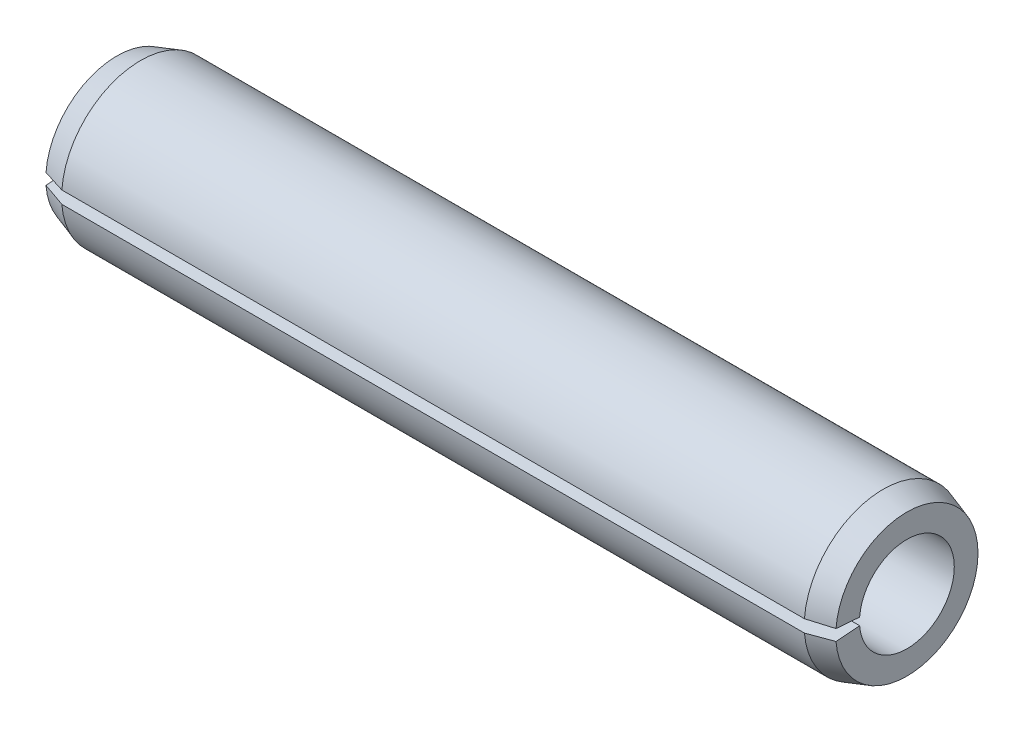
ISO-10303-21;
HEADER;
FILE_DESCRIPTION(('STEP AP214'),'2;1');
FILE_NAME('part.step','',(''),(''),'','','');
FILE_SCHEMA(('AUTOMOTIVE_DESIGN { 1 0 10303 214 1 1 1 1 }'));
ENDSEC;
DATA;
#1=APPLICATION_CONTEXT('core data for automotive mechanical design processes');
#2=APPLICATION_PROTOCOL_DEFINITION('international standard','automotive_design',2000,#1);
#3=PRODUCT_CONTEXT('',#1,'mechanical');
#4=PRODUCT('Part','Part','',(#3));
#5=PRODUCT_RELATED_PRODUCT_CATEGORY('part','',(#4));
#6=PRODUCT_DEFINITION_FORMATION('','',#4);
#7=PRODUCT_DEFINITION_CONTEXT('part definition',#1,'design');
#8=PRODUCT_DEFINITION('design','',#6,#7);
#9=PRODUCT_DEFINITION_SHAPE('','',#8);
#10=(LENGTH_UNIT() NAMED_UNIT(*) SI_UNIT(.MILLI.,.METRE.));
#11=(NAMED_UNIT(*) PLANE_ANGLE_UNIT() SI_UNIT($,.RADIAN.));
#12=(NAMED_UNIT(*) SI_UNIT($,.STERADIAN.) SOLID_ANGLE_UNIT());
#13=UNCERTAINTY_MEASURE_WITH_UNIT(LENGTH_MEASURE(1.E-05),#10,'distance_accuracy_value','');
#14=(GEOMETRIC_REPRESENTATION_CONTEXT(3) GLOBAL_UNCERTAINTY_ASSIGNED_CONTEXT((#13)) GLOBAL_UNIT_ASSIGNED_CONTEXT((#10,
#11,#12)) REPRESENTATION_CONTEXT('',''));
#15=CARTESIAN_POINT('',(0.,0.,0.));
#16=DIRECTION('',(0.,0.,1.));
#17=DIRECTION('',(1.,0.,0.));
#18=AXIS2_PLACEMENT_3D('',#15,#16,#17);
#19=CARTESIAN_POINT('',(0.,0.9,0.));
#20=DIRECTION('',(1.,0.,0.));
#21=DIRECTION('',(0.,0.,-1.));
#22=AXIS2_PLACEMENT_3D('',#19,#20,#21);
#23=PLANE('',#22);
#24=DIRECTION('',(0.,0.0784590957278456,0.996917333733128));
#25=VECTOR('',#24,1.);
#26=CARTESIAN_POINT('',(0.,0.,0.));
#27=LINE('',#26,#25);
#28=CARTESIAN_POINT('',(0.,0.0470754574367074,0.598150400239877));
#29=VERTEX_POINT('',#28);
#30=CARTESIAN_POINT('',(0.,0.0706131861550611,0.897225600359815));
#31=VERTEX_POINT('',#30);
#32=EDGE_CURVE('E82',#29,#31,#27,.T.);
#33=ORIENTED_EDGE('',*,*,#32,.T.);
#34=CARTESIAN_POINT('',(0.,0.,0.));
#35=DIRECTION('',(-1.,0.,0.));
#36=DIRECTION('',(0.,0.,1.));
#37=AXIS2_PLACEMENT_3D('',#34,#35,#36);
#38=CIRCLE('',#37,0.9);
#39=CARTESIAN_POINT('',(0.,-0.0706131861550611,0.897225600359815));
#40=VERTEX_POINT('',#39);
#41=EDGE_CURVE('E100',#31,#40,#38,.T.);
#42=ORIENTED_EDGE('',*,*,#41,.T.);
#43=DIRECTION('',(0.,-0.0784590957278456,0.996917333733128));
#44=VECTOR('',#43,1.);
#45=CARTESIAN_POINT('',(0.,0.,0.));
#46=LINE('',#45,#44);
#47=CARTESIAN_POINT('',(0.,-0.0470754574367074,0.598150400239877));
#48=VERTEX_POINT('',#47);
#49=EDGE_CURVE('E54',#48,#40,#46,.T.);
#50=ORIENTED_EDGE('',*,*,#49,.F.);
#51=CARTESIAN_POINT('',(0.,0.,0.));
#52=DIRECTION('',(-1.,0.,0.));
#53=DIRECTION('',(0.,0.,1.));
#54=AXIS2_PLACEMENT_3D('',#51,#52,#53);
#55=CIRCLE('',#54,0.6);
#56=EDGE_CURVE('E97',#29,#48,#55,.T.);
#57=ORIENTED_EDGE('',*,*,#56,.F.);
#58=EDGE_LOOP('',(#33,#42,#50,#57));
#59=FACE_BOUND('',#58,.T.);
#60=ADVANCED_FACE('F33',(#59),#23,.F.);
#61=CARTESIAN_POINT('',(-9.52499999999999,0.,0.));
#62=DIRECTION('',(-1.,0.,0.));
#63=DIRECTION('',(0.,0.,1.));
#64=AXIS2_PLACEMENT_3D('',#61,#62,#63);
#65=CYLINDRICAL_SURFACE('',#64,0.6);
#66=DIRECTION('',(-1.,0.,0.));
#67=VECTOR('',#66,1.);
#68=CARTESIAN_POINT('',(-9.52499999999999,0.0470754574367074,0.598150400239877));
#69=LINE('',#68,#67);
#70=CARTESIAN_POINT('',(10.,0.0470754574367074,0.598150400239877));
#71=VERTEX_POINT('',#70);
#72=EDGE_CURVE('E85',#29,#71,#69,.F.);
#73=ORIENTED_EDGE('',*,*,#72,.F.);
#74=ORIENTED_EDGE('',*,*,#56,.T.);
#75=DIRECTION('',(-1.,0.,0.));
#76=VECTOR('',#75,1.);
#77=CARTESIAN_POINT('',(-9.52499999999999,-0.0470754574367074,0.598150400239877));
#78=LINE('',#77,#76);
#79=CARTESIAN_POINT('',(10.,-0.0470754574367074,0.598150400239877));
#80=VERTEX_POINT('',#79);
#81=EDGE_CURVE('E118',#48,#80,#78,.F.);
#82=ORIENTED_EDGE('',*,*,#81,.T.);
#83=CARTESIAN_POINT('',(10.,0.,0.));
#84=DIRECTION('',(-1.,0.,0.));
#85=DIRECTION('',(0.,0.,1.));
#86=AXIS2_PLACEMENT_3D('',#83,#84,#85);
#87=CIRCLE('',#86,0.6);
#88=EDGE_CURVE('E99',#71,#80,#87,.T.);
#89=ORIENTED_EDGE('',*,*,#88,.F.);
#90=EDGE_LOOP('',(#73,#74,#82,#89));
#91=FACE_BOUND('',#90,.T.);
#92=ADVANCED_FACE('F95',(#91),#65,.F.);
#93=CARTESIAN_POINT('',(10.,0.6,0.));
#94=DIRECTION('',(-1.,0.,0.));
#95=DIRECTION('',(0.,0.,1.));
#96=AXIS2_PLACEMENT_3D('',#93,#94,#95);
#97=PLANE('',#96);
#98=DIRECTION('',(0.,0.0784590957278456,0.996917333733128));
#99=VECTOR('',#98,1.);
#100=CARTESIAN_POINT('',(10.,0.,0.));
#101=LINE('',#100,#99);
#102=CARTESIAN_POINT('',(10.,0.0706131861550611,0.897225600359815));
#103=VERTEX_POINT('',#102);
#104=EDGE_CURVE('E127',#71,#103,#101,.T.);
#105=ORIENTED_EDGE('',*,*,#104,.F.);
#106=ORIENTED_EDGE('',*,*,#88,.T.);
#107=DIRECTION('',(0.,-0.0784590957278456,0.996917333733128));
#108=VECTOR('',#107,1.);
#109=CARTESIAN_POINT('',(10.,0.,0.));
#110=LINE('',#109,#108);
#111=CARTESIAN_POINT('',(10.,-0.0706131861550611,0.897225600359815));
#112=VERTEX_POINT('',#111);
#113=EDGE_CURVE('E126',#80,#112,#110,.T.);
#114=ORIENTED_EDGE('',*,*,#113,.T.);
#115=CARTESIAN_POINT('',(10.,0.,0.));
#116=DIRECTION('',(-1.,0.,0.));
#117=DIRECTION('',(0.,0.,1.));
#118=AXIS2_PLACEMENT_3D('',#115,#116,#117);
#119=CIRCLE('',#118,0.9);
#120=EDGE_CURVE('E104',#103,#112,#119,.T.);
#121=ORIENTED_EDGE('',*,*,#120,.F.);
#122=EDGE_LOOP('',(#105,#106,#114,#121));
#123=FACE_BOUND('',#122,.T.);
#124=ADVANCED_FACE('F137',(#123),#97,.F.);
#125=CARTESIAN_POINT('',(10.,0.,0.));
#126=DIRECTION('',(-1.,0.,0.));
#127=DIRECTION('',(0.,0.,1.));
#128=AXIS2_PLACEMENT_3D('',#125,#126,#127);
#129=CONICAL_SURFACE('',#128,0.9,0.321750554396644);
#130=DIRECTION('',(-0.948683298050513,0.024810944565718,0.315252941349891));
#131=VECTOR('',#130,1.);
#132=CARTESIAN_POINT('',(12.7,0.,0.));
#133=LINE('',#132,#131);
#134=CARTESIAN_POINT('',(9.7,0.0784590957278457,0.996917333733128));
#135=VERTEX_POINT('',#134);
#136=EDGE_CURVE('E101',#103,#135,#133,.T.);
#137=ORIENTED_EDGE('',*,*,#136,.F.);
#138=ORIENTED_EDGE('',*,*,#120,.T.);
#139=DIRECTION('',(-0.948683298050513,-0.024810944565718,0.315252941349891));
#140=VECTOR('',#139,1.);
#141=CARTESIAN_POINT('',(12.7,0.,0.));
#142=LINE('',#141,#140);
#143=CARTESIAN_POINT('',(9.7,-0.0784590957278457,0.996917333733128));
#144=VERTEX_POINT('',#143);
#145=EDGE_CURVE('E120',#112,#144,#142,.T.);
#146=ORIENTED_EDGE('',*,*,#145,.T.);
#147=CARTESIAN_POINT('',(9.7,0.,0.));
#148=DIRECTION('',(-1.,0.,0.));
#149=DIRECTION('',(0.,0.,1.));
#150=AXIS2_PLACEMENT_3D('',#147,#148,#149);
#151=CIRCLE('',#150,1.);
#152=EDGE_CURVE('E109',#135,#144,#151,.T.);
#153=ORIENTED_EDGE('',*,*,#152,.F.);
#154=EDGE_LOOP('',(#137,#138,#146,#153));
#155=FACE_BOUND('',#154,.T.);
#156=ADVANCED_FACE('F136',(#155),#129,.T.);
#157=CARTESIAN_POINT('',(-9.52499999999999,0.,0.));
#158=DIRECTION('',(-1.,0.,0.));
#159=DIRECTION('',(0.,0.,1.));
#160=AXIS2_PLACEMENT_3D('',#157,#158,#159);
#161=CYLINDRICAL_SURFACE('',#160,1.);
#162=DIRECTION('',(-1.,0.,0.));
#163=VECTOR('',#162,1.);
#164=CARTESIAN_POINT('',(-9.52499999999999,0.0784590957278457,0.996917333733128));
#165=LINE('',#164,#163);
#166=CARTESIAN_POINT('',(0.3,0.0784590957278456,0.996917333733128));
#167=VERTEX_POINT('',#166);
#168=EDGE_CURVE('E46',#135,#167,#165,.T.);
#169=ORIENTED_EDGE('',*,*,#168,.F.);
#170=ORIENTED_EDGE('',*,*,#152,.T.);
#171=DIRECTION('',(-1.,0.,0.));
#172=VECTOR('',#171,1.);
#173=CARTESIAN_POINT('',(-9.52499999999999,-0.0784590957278457,0.996917333733128));
#174=LINE('',#173,#172);
#175=CARTESIAN_POINT('',(0.3,-0.0784590957278456,0.996917333733128));
#176=VERTEX_POINT('',#175);
#177=EDGE_CURVE('E123',#144,#176,#174,.T.);
#178=ORIENTED_EDGE('',*,*,#177,.T.);
#179=CARTESIAN_POINT('',(0.3,0.,0.));
#180=DIRECTION('',(-1.,0.,0.));
#181=DIRECTION('',(0.,0.,1.));
#182=AXIS2_PLACEMENT_3D('',#179,#180,#181);
#183=CIRCLE('',#182,1.);
#184=EDGE_CURVE('E112',#167,#176,#183,.T.);
#185=ORIENTED_EDGE('',*,*,#184,.F.);
#186=EDGE_LOOP('',(#169,#170,#178,#185));
#187=FACE_BOUND('',#186,.T.);
#188=ADVANCED_FACE('F140',(#187),#161,.T.);
#189=CARTESIAN_POINT('',(0.3,0.,0.));
#190=DIRECTION('',(1.,0.,0.));
#191=DIRECTION('',(0.,0.,-1.));
#192=AXIS2_PLACEMENT_3D('',#189,#190,#191);
#193=CONICAL_SURFACE('',#192,1.,0.321750554396642);
#194=DIRECTION('',(-0.948683298050514,-0.0248109445657179,-0.31525294134989));
#195=VECTOR('',#194,1.);
#196=CARTESIAN_POINT('',(-2.7,0.,0.));
#197=LINE('',#196,#195);
#198=EDGE_CURVE('E11',#167,#31,#197,.T.);
#199=ORIENTED_EDGE('',*,*,#198,.F.);
#200=ORIENTED_EDGE('',*,*,#184,.T.);
#201=DIRECTION('',(-0.948683298050514,0.0248109445657179,-0.31525294134989));
#202=VECTOR('',#201,1.);
#203=CARTESIAN_POINT('',(-2.7,0.,0.));
#204=LINE('',#203,#202);
#205=EDGE_CURVE('E40',#176,#40,#204,.T.);
#206=ORIENTED_EDGE('',*,*,#205,.T.);
#207=ORIENTED_EDGE('',*,*,#41,.F.);
#208=EDGE_LOOP('',(#199,#200,#206,#207));
#209=FACE_BOUND('',#208,.T.);
#210=ADVANCED_FACE('F143',(#209),#193,.T.);
#211=CARTESIAN_POINT('',(10.,0.,0.));
#212=DIRECTION('',(0.,-0.996917333733128,-0.0784590957278456));
#213=DIRECTION('',(0.,0.0784590957278456,-0.996917333733128));
#214=AXIS2_PLACEMENT_3D('',#211,#212,#213);
#215=PLANE('',#214);
#216=ORIENTED_EDGE('',*,*,#49,.T.);
#217=ORIENTED_EDGE('',*,*,#205,.F.);
#218=ORIENTED_EDGE('',*,*,#177,.F.);
#219=ORIENTED_EDGE('',*,*,#145,.F.);
#220=ORIENTED_EDGE('',*,*,#113,.F.);
#221=ORIENTED_EDGE('',*,*,#81,.F.);
#222=EDGE_LOOP('',(#216,#217,#218,#219,#220,#221));
#223=FACE_BOUND('',#222,.T.);
#224=ADVANCED_FACE('F138',(#223),#215,.F.);
#225=CARTESIAN_POINT('',(10.,0.,0.));
#226=DIRECTION('',(0.,-0.996917333733128,0.0784590957278456));
#227=DIRECTION('',(0.,-0.0784590957278456,-0.996917333733128));
#228=AXIS2_PLACEMENT_3D('',#225,#226,#227);
#229=PLANE('',#228);
#230=ORIENTED_EDGE('',*,*,#72,.T.);
#231=ORIENTED_EDGE('',*,*,#104,.T.);
#232=ORIENTED_EDGE('',*,*,#136,.T.);
#233=ORIENTED_EDGE('',*,*,#168,.T.);
#234=ORIENTED_EDGE('',*,*,#198,.T.);
#235=ORIENTED_EDGE('',*,*,#32,.F.);
#236=EDGE_LOOP('',(#230,#231,#232,#233,#234,#235));
#237=FACE_BOUND('',#236,.T.);
#238=ADVANCED_FACE('F84',(#237),#229,.T.);
#239=CLOSED_SHELL('',(#60,#92,#124,#156,#188,#210,#224,#238));
#240=MANIFOLD_SOLID_BREP('B2',#239);
#241=ADVANCED_BREP_SHAPE_REPRESENTATION('',(#18,#240),#14);
#242=SHAPE_DEFINITION_REPRESENTATION(#9,#241);
ENDSEC;
END-ISO-10303-21;
